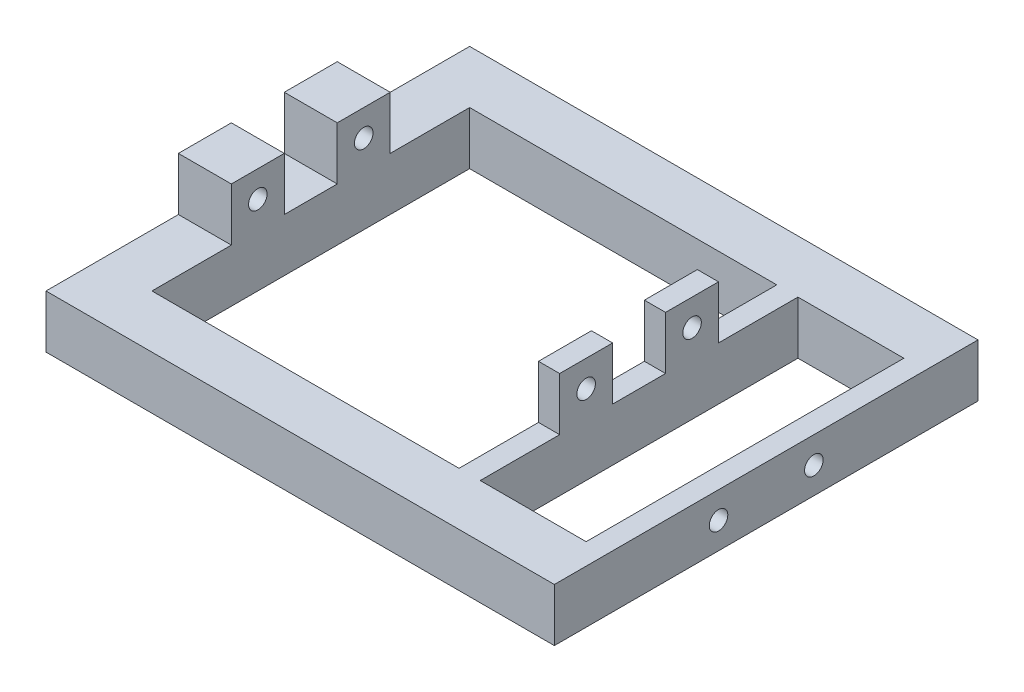
ISO-10303-21;
HEADER;
FILE_DESCRIPTION(('STEP AP214'),'2;1');
FILE_NAME('part.step','',(''),(''),'','','');
FILE_SCHEMA(('AUTOMOTIVE_DESIGN { 1 0 10303 214 1 1 1 1 }'));
ENDSEC;
DATA;
#1=APPLICATION_CONTEXT('core data for automotive mechanical design processes');
#2=APPLICATION_PROTOCOL_DEFINITION('international standard','automotive_design',2000,#1);
#3=PRODUCT_CONTEXT('',#1,'mechanical');
#4=PRODUCT('Part','Part','',(#3));
#5=PRODUCT_RELATED_PRODUCT_CATEGORY('part','',(#4));
#6=PRODUCT_DEFINITION_FORMATION('','',#4);
#7=PRODUCT_DEFINITION_CONTEXT('part definition',#1,'design');
#8=PRODUCT_DEFINITION('design','',#6,#7);
#9=PRODUCT_DEFINITION_SHAPE('','',#8);
#10=(LENGTH_UNIT() NAMED_UNIT(*) SI_UNIT(.MILLI.,.METRE.));
#11=(NAMED_UNIT(*) PLANE_ANGLE_UNIT() SI_UNIT($,.RADIAN.));
#12=(NAMED_UNIT(*) SI_UNIT($,.STERADIAN.) SOLID_ANGLE_UNIT());
#13=UNCERTAINTY_MEASURE_WITH_UNIT(LENGTH_MEASURE(1.E-05),#10,'distance_accuracy_value','');
#14=(GEOMETRIC_REPRESENTATION_CONTEXT(3) GLOBAL_UNCERTAINTY_ASSIGNED_CONTEXT((#13)) GLOBAL_UNIT_ASSIGNED_CONTEXT((#10,
#11,#12)) REPRESENTATION_CONTEXT('',''));
#15=CARTESIAN_POINT('',(0.,0.,0.));
#16=DIRECTION('',(0.,0.,1.));
#17=DIRECTION('',(1.,0.,0.));
#18=AXIS2_PLACEMENT_3D('',#15,#16,#17);
#19=CARTESIAN_POINT('',(0.,10.,0.));
#20=DIRECTION('',(0.,-1.,0.));
#21=DIRECTION('',(0.,0.,-1.));
#22=AXIS2_PLACEMENT_3D('',#19,#20,#21);
#23=PLANE('',#22);
#24=DIRECTION('',(1.,0.,0.));
#25=VECTOR('',#24,1.);
#26=CARTESIAN_POINT('',(0.,10.,-25.));
#27=LINE('',#26,#25);
#28=CARTESIAN_POINT('',(68.,10.,-25.));
#29=VERTEX_POINT('',#28);
#30=CARTESIAN_POINT('',(72.,10.,-25.));
#31=VERTEX_POINT('',#30);
#32=EDGE_CURVE('E442',#29,#31,#27,.T.);
#33=ORIENTED_EDGE('',*,*,#32,.F.);
#34=DIRECTION('',(0.,0.,-1.));
#35=VECTOR('',#34,1.);
#36=CARTESIAN_POINT('',(68.,10.,0.002000000000002));
#37=LINE('',#36,#35);
#38=CARTESIAN_POINT('',(68.,10.,-10.));
#39=VERTEX_POINT('',#38);
#40=EDGE_CURVE('E246',#39,#29,#37,.T.);
#41=ORIENTED_EDGE('',*,*,#40,.F.);
#42=DIRECTION('',(1.,0.,0.));
#43=VECTOR('',#42,1.);
#44=CARTESIAN_POINT('',(10.,10.,-10.));
#45=LINE('',#44,#43);
#46=CARTESIAN_POINT('',(10.,10.,-10.));
#47=VERTEX_POINT('',#46);
#48=EDGE_CURVE('E352',#47,#39,#45,.T.);
#49=ORIENTED_EDGE('',*,*,#48,.F.);
#50=DIRECTION('',(0.,0.,1.));
#51=VECTOR('',#50,1.);
#52=CARTESIAN_POINT('',(10.,10.,-70.));
#53=LINE('',#52,#51);
#54=CARTESIAN_POINT('',(10.,10.,-25.));
#55=VERTEX_POINT('',#54);
#56=EDGE_CURVE('E351',#55,#47,#53,.T.);
#57=ORIENTED_EDGE('',*,*,#56,.F.);
#58=DIRECTION('',(1.,0.,0.));
#59=VECTOR('',#58,1.);
#60=CARTESIAN_POINT('',(0.,10.,-25.));
#61=LINE('',#60,#59);
#62=CARTESIAN_POINT('',(0.,10.,-25.));
#63=VERTEX_POINT('',#62);
#64=EDGE_CURVE('E275',#63,#55,#61,.T.);
#65=ORIENTED_EDGE('',*,*,#64,.F.);
#66=DIRECTION('',(0.,0.,1.));
#67=VECTOR('',#66,1.);
#68=CARTESIAN_POINT('',(0.,10.,0.));
#69=LINE('',#68,#67);
#70=CARTESIAN_POINT('',(0.,10.,0.));
#71=VERTEX_POINT('',#70);
#72=EDGE_CURVE('E395',#63,#71,#69,.T.);
#73=ORIENTED_EDGE('',*,*,#72,.T.);
#74=DIRECTION('',(1.,0.,0.));
#75=VECTOR('',#74,1.);
#76=CARTESIAN_POINT('',(0.,10.,0.));
#77=LINE('',#76,#75);
#78=CARTESIAN_POINT('',(96.,10.,0.));
#79=VERTEX_POINT('',#78);
#80=EDGE_CURVE('E387',#71,#79,#77,.T.);
#81=ORIENTED_EDGE('',*,*,#80,.T.);
#82=DIRECTION('',(0.,0.,-1.));
#83=VECTOR('',#82,1.);
#84=CARTESIAN_POINT('',(96.,10.,-80.));
#85=LINE('',#84,#83);
#86=CARTESIAN_POINT('',(96.,10.,-80.));
#87=VERTEX_POINT('',#86);
#88=EDGE_CURVE('E390',#79,#87,#85,.T.);
#89=ORIENTED_EDGE('',*,*,#88,.T.);
#90=DIRECTION('',(-1.,0.,0.));
#91=VECTOR('',#90,1.);
#92=CARTESIAN_POINT('',(0.,10.,-80.));
#93=LINE('',#92,#91);
#94=CARTESIAN_POINT('',(0.,10.,-80.));
#95=VERTEX_POINT('',#94);
#96=EDGE_CURVE('E393',#87,#95,#93,.T.);
#97=ORIENTED_EDGE('',*,*,#96,.T.);
#98=CARTESIAN_POINT('',(0.,10.,-55.));
#99=VERTEX_POINT('',#98);
#100=EDGE_CURVE('E396',#95,#99,#69,.T.);
#101=ORIENTED_EDGE('',*,*,#100,.T.);
#102=DIRECTION('',(1.,0.,0.));
#103=VECTOR('',#102,1.);
#104=CARTESIAN_POINT('',(0.,10.,-55.));
#105=LINE('',#104,#103);
#106=CARTESIAN_POINT('',(10.,10.,-55.));
#107=VERTEX_POINT('',#106);
#108=EDGE_CURVE('E298',#99,#107,#105,.T.);
#109=ORIENTED_EDGE('',*,*,#108,.T.);
#110=CARTESIAN_POINT('',(10.,10.,-70.));
#111=VERTEX_POINT('',#110);
#112=EDGE_CURVE('E346',#111,#107,#53,.T.);
#113=ORIENTED_EDGE('',*,*,#112,.F.);
#114=DIRECTION('',(-1.,0.,0.));
#115=VECTOR('',#114,1.);
#116=CARTESIAN_POINT('',(10.,10.,-70.));
#117=LINE('',#116,#115);
#118=CARTESIAN_POINT('',(68.,10.,-70.));
#119=VERTEX_POINT('',#118);
#120=EDGE_CURVE('E358',#119,#111,#117,.T.);
#121=ORIENTED_EDGE('',*,*,#120,.F.);
#122=CARTESIAN_POINT('',(68.,10.,-55.));
#123=VERTEX_POINT('',#122);
#124=EDGE_CURVE('E342',#123,#119,#37,.T.);
#125=ORIENTED_EDGE('',*,*,#124,.F.);
#126=DIRECTION('',(1.,0.,0.));
#127=VECTOR('',#126,1.);
#128=CARTESIAN_POINT('',(0.,10.,-55.));
#129=LINE('',#128,#127);
#130=CARTESIAN_POINT('',(72.,10.,-55.));
#131=VERTEX_POINT('',#130);
#132=EDGE_CURVE('E62',#123,#131,#129,.T.);
#133=ORIENTED_EDGE('',*,*,#132,.T.);
#134=DIRECTION('',(0.,0.,-1.));
#135=VECTOR('',#134,1.);
#136=CARTESIAN_POINT('',(72.,10.,0.002000000000002));
#137=LINE('',#136,#135);
#138=CARTESIAN_POINT('',(72.,10.,-70.));
#139=VERTEX_POINT('',#138);
#140=EDGE_CURVE('E338',#131,#139,#137,.T.);
#141=ORIENTED_EDGE('',*,*,#140,.T.);
#142=CARTESIAN_POINT('',(92.,10.,-70.));
#143=VERTEX_POINT('',#142);
#144=EDGE_CURVE('E359',#143,#139,#117,.T.);
#145=ORIENTED_EDGE('',*,*,#144,.F.);
#146=DIRECTION('',(0.,0.,-1.));
#147=VECTOR('',#146,1.);
#148=CARTESIAN_POINT('',(92.,10.,-70.));
#149=LINE('',#148,#147);
#150=CARTESIAN_POINT('',(92.,10.,-10.));
#151=VERTEX_POINT('',#150);
#152=EDGE_CURVE('E355',#151,#143,#149,.T.);
#153=ORIENTED_EDGE('',*,*,#152,.F.);
#154=CARTESIAN_POINT('',(72.,10.,-10.));
#155=VERTEX_POINT('',#154);
#156=EDGE_CURVE('E349',#155,#151,#45,.T.);
#157=ORIENTED_EDGE('',*,*,#156,.F.);
#158=EDGE_CURVE('E339',#155,#31,#137,.T.);
#159=ORIENTED_EDGE('',*,*,#158,.T.);
#160=EDGE_LOOP('',(#33,#41,#49,#57,#65,#73,#81,#89,#97,#101,#109,#113,#121,#125,#133,#141,#145,
#153,#157,#159));
#161=FACE_BOUND('',#160,.T.);
#162=ADVANCED_FACE('F37',(#161),#23,.F.);
#163=CARTESIAN_POINT('',(68.,10.,-35.));
#164=VERTEX_POINT('',#163);
#165=CARTESIAN_POINT('',(68.,10.,-45.));
#166=VERTEX_POINT('',#165);
#167=EDGE_CURVE('E345',#164,#166,#37,.T.);
#168=ORIENTED_EDGE('',*,*,#167,.F.);
#169=DIRECTION('',(1.,0.,0.));
#170=VECTOR('',#169,1.);
#171=CARTESIAN_POINT('',(0.,10.,-35.));
#172=LINE('',#171,#170);
#173=CARTESIAN_POINT('',(72.,10.,-35.));
#174=VERTEX_POINT('',#173);
#175=EDGE_CURVE('E54',#164,#174,#172,.T.);
#176=ORIENTED_EDGE('',*,*,#175,.T.);
#177=CARTESIAN_POINT('',(72.,10.,-45.));
#178=VERTEX_POINT('',#177);
#179=EDGE_CURVE('E343',#174,#178,#137,.T.);
#180=ORIENTED_EDGE('',*,*,#179,.T.);
#181=DIRECTION('',(1.,0.,0.));
#182=VECTOR('',#181,1.);
#183=CARTESIAN_POINT('',(0.,10.,-45.));
#184=LINE('',#183,#182);
#185=EDGE_CURVE('E248',#166,#178,#184,.T.);
#186=ORIENTED_EDGE('',*,*,#185,.F.);
#187=EDGE_LOOP('',(#168,#176,#180,#186));
#188=FACE_BOUND('',#187,.T.);
#189=ADVANCED_FACE('F455',(#188),#23,.F.);
#190=DIRECTION('',(-1.,0.,0.));
#191=VECTOR('',#190,1.);
#192=CARTESIAN_POINT('',(0.,10.,-35.));
#193=LINE('',#192,#191);
#194=CARTESIAN_POINT('',(10.,10.,-35.));
#195=VERTEX_POINT('',#194);
#196=CARTESIAN_POINT('',(0.,10.,-35.));
#197=VERTEX_POINT('',#196);
#198=EDGE_CURVE('E280',#195,#197,#193,.T.);
#199=ORIENTED_EDGE('',*,*,#198,.F.);
#200=CARTESIAN_POINT('',(10.,10.,-45.));
#201=VERTEX_POINT('',#200);
#202=EDGE_CURVE('E350',#201,#195,#53,.T.);
#203=ORIENTED_EDGE('',*,*,#202,.F.);
#204=DIRECTION('',(-1.,0.,0.));
#205=VECTOR('',#204,1.);
#206=CARTESIAN_POINT('',(0.,10.,-45.));
#207=LINE('',#206,#205);
#208=CARTESIAN_POINT('',(0.,10.,-45.));
#209=VERTEX_POINT('',#208);
#210=EDGE_CURVE('E303',#201,#209,#207,.T.);
#211=ORIENTED_EDGE('',*,*,#210,.T.);
#212=EDGE_CURVE('E400',#209,#197,#69,.T.);
#213=ORIENTED_EDGE('',*,*,#212,.T.);
#214=EDGE_LOOP('',(#199,#203,#211,#213));
#215=FACE_BOUND('',#214,.T.);
#216=ADVANCED_FACE('F497',(#215),#23,.F.);
#217=CARTESIAN_POINT('',(10.,10.,-10.));
#218=DIRECTION('',(0.,0.,-1.));
#219=DIRECTION('',(-1.,0.,0.));
#220=AXIS2_PLACEMENT_3D('',#217,#218,#219);
#221=PLANE('',#220);
#222=DIRECTION('',(1.,0.,0.));
#223=VECTOR('',#222,1.);
#224=CARTESIAN_POINT('',(10.,0.,-10.));
#225=LINE('',#224,#223);
#226=CARTESIAN_POINT('',(72.,0.,-10.));
#227=VERTEX_POINT('',#226);
#228=CARTESIAN_POINT('',(92.,0.,-10.));
#229=VERTEX_POINT('',#228);
#230=EDGE_CURVE('E365',#227,#229,#225,.T.);
#231=ORIENTED_EDGE('',*,*,#230,.F.);
#232=DIRECTION('',(0.,-1.,0.));
#233=VECTOR('',#232,1.);
#234=CARTESIAN_POINT('',(72.,10.,-10.));
#235=LINE('',#234,#233);
#236=EDGE_CURVE('E324',#155,#227,#235,.T.);
#237=ORIENTED_EDGE('',*,*,#236,.F.);
#238=ORIENTED_EDGE('',*,*,#156,.T.);
#239=DIRECTION('',(0.,-1.,0.));
#240=VECTOR('',#239,1.);
#241=CARTESIAN_POINT('',(92.,10.,-10.));
#242=LINE('',#241,#240);
#243=EDGE_CURVE('E380',#151,#229,#242,.T.);
#244=ORIENTED_EDGE('',*,*,#243,.T.);
#245=EDGE_LOOP('',(#231,#237,#238,#244));
#246=FACE_BOUND('',#245,.T.);
#247=ADVANCED_FACE('F478',(#246),#221,.T.);
#248=ORIENTED_EDGE('',*,*,#48,.T.);
#249=DIRECTION('',(0.,1.,0.));
#250=VECTOR('',#249,1.);
#251=CARTESIAN_POINT('',(68.,10.,-10.));
#252=LINE('',#251,#250);
#253=CARTESIAN_POINT('',(68.,0.,-10.));
#254=VERTEX_POINT('',#253);
#255=EDGE_CURVE('E322',#254,#39,#252,.T.);
#256=ORIENTED_EDGE('',*,*,#255,.F.);
#257=CARTESIAN_POINT('',(10.,0.,-10.));
#258=VERTEX_POINT('',#257);
#259=EDGE_CURVE('E366',#258,#254,#225,.T.);
#260=ORIENTED_EDGE('',*,*,#259,.F.);
#261=DIRECTION('',(0.,-1.,0.));
#262=VECTOR('',#261,1.);
#263=CARTESIAN_POINT('',(10.,10.,-10.));
#264=LINE('',#263,#262);
#265=EDGE_CURVE('E383',#47,#258,#264,.T.);
#266=ORIENTED_EDGE('',*,*,#265,.F.);
#267=EDGE_LOOP('',(#248,#256,#260,#266));
#268=FACE_BOUND('',#267,.T.);
#269=ADVANCED_FACE('F507',(#268),#221,.T.);
#270=CARTESIAN_POINT('',(10.,10.,-70.));
#271=DIRECTION('',(0.,0.,1.));
#272=DIRECTION('',(1.,0.,0.));
#273=AXIS2_PLACEMENT_3D('',#270,#271,#272);
#274=PLANE('',#273);
#275=ORIENTED_EDGE('',*,*,#144,.T.);
#276=DIRECTION('',(0.,1.,0.));
#277=VECTOR('',#276,1.);
#278=CARTESIAN_POINT('',(72.,10.,-70.));
#279=LINE('',#278,#277);
#280=CARTESIAN_POINT('',(72.,0.,-70.));
#281=VERTEX_POINT('',#280);
#282=EDGE_CURVE('E328',#281,#139,#279,.T.);
#283=ORIENTED_EDGE('',*,*,#282,.F.);
#284=DIRECTION('',(-1.,0.,0.));
#285=VECTOR('',#284,1.);
#286=CARTESIAN_POINT('',(10.,0.,-70.));
#287=LINE('',#286,#285);
#288=CARTESIAN_POINT('',(92.,0.,-70.));
#289=VERTEX_POINT('',#288);
#290=EDGE_CURVE('E373',#289,#281,#287,.T.);
#291=ORIENTED_EDGE('',*,*,#290,.F.);
#292=DIRECTION('',(0.,-1.,0.));
#293=VECTOR('',#292,1.);
#294=CARTESIAN_POINT('',(92.,10.,-70.));
#295=LINE('',#294,#293);
#296=EDGE_CURVE('E378',#143,#289,#295,.T.);
#297=ORIENTED_EDGE('',*,*,#296,.F.);
#298=EDGE_LOOP('',(#275,#283,#291,#297));
#299=FACE_BOUND('',#298,.T.);
#300=ADVANCED_FACE('F469',(#299),#274,.T.);
#301=CARTESIAN_POINT('',(68.,0.,-70.));
#302=VERTEX_POINT('',#301);
#303=CARTESIAN_POINT('',(10.,0.,-70.));
#304=VERTEX_POINT('',#303);
#305=EDGE_CURVE('E372',#302,#304,#287,.T.);
#306=ORIENTED_EDGE('',*,*,#305,.F.);
#307=DIRECTION('',(0.,-1.,0.));
#308=VECTOR('',#307,1.);
#309=CARTESIAN_POINT('',(68.,10.,-70.));
#310=LINE('',#309,#308);
#311=EDGE_CURVE('E331',#119,#302,#310,.T.);
#312=ORIENTED_EDGE('',*,*,#311,.F.);
#313=ORIENTED_EDGE('',*,*,#120,.T.);
#314=DIRECTION('',(0.,-1.,0.));
#315=VECTOR('',#314,1.);
#316=CARTESIAN_POINT('',(10.,10.,-70.));
#317=LINE('',#316,#315);
#318=EDGE_CURVE('E362',#111,#304,#317,.T.);
#319=ORIENTED_EDGE('',*,*,#318,.T.);
#320=EDGE_LOOP('',(#306,#312,#313,#319));
#321=FACE_BOUND('',#320,.T.);
#322=ADVANCED_FACE('F482',(#321),#274,.T.);
#323=CARTESIAN_POINT('',(0.,0.,0.));
#324=DIRECTION('',(0.,-1.,0.));
#325=DIRECTION('',(0.,0.,-1.));
#326=AXIS2_PLACEMENT_3D('',#323,#324,#325);
#327=PLANE('',#326);
#328=ORIENTED_EDGE('',*,*,#259,.T.);
#329=DIRECTION('',(0.,0.,-1.));
#330=VECTOR('',#329,1.);
#331=CARTESIAN_POINT('',(68.,0.,0.002000000000002));
#332=LINE('',#331,#330);
#333=EDGE_CURVE('E327',#254,#302,#332,.T.);
#334=ORIENTED_EDGE('',*,*,#333,.T.);
#335=ORIENTED_EDGE('',*,*,#305,.T.);
#336=DIRECTION('',(0.,0.,1.));
#337=VECTOR('',#336,1.);
#338=CARTESIAN_POINT('',(10.,0.,-70.));
#339=LINE('',#338,#337);
#340=EDGE_CURVE('E333',#304,#258,#339,.T.);
#341=ORIENTED_EDGE('',*,*,#340,.T.);
#342=EDGE_LOOP('',(#328,#334,#335,#341));
#343=FACE_BOUND('',#342,.T.);
#344=DIRECTION('',(1.,0.,0.));
#345=VECTOR('',#344,1.);
#346=CARTESIAN_POINT('',(0.,0.,0.));
#347=LINE('',#346,#345);
#348=CARTESIAN_POINT('',(0.,0.,0.));
#349=VERTEX_POINT('',#348);
#350=CARTESIAN_POINT('',(96.,0.,0.));
#351=VERTEX_POINT('',#350);
#352=EDGE_CURVE('E386',#349,#351,#347,.T.);
#353=ORIENTED_EDGE('',*,*,#352,.F.);
#354=DIRECTION('',(0.,0.,1.));
#355=VECTOR('',#354,1.);
#356=CARTESIAN_POINT('',(0.,0.,0.));
#357=LINE('',#356,#355);
#358=CARTESIAN_POINT('',(0.,0.,-80.));
#359=VERTEX_POINT('',#358);
#360=EDGE_CURVE('E391',#359,#349,#357,.T.);
#361=ORIENTED_EDGE('',*,*,#360,.F.);
#362=DIRECTION('',(-1.,0.,0.));
#363=VECTOR('',#362,1.);
#364=CARTESIAN_POINT('',(0.,0.,-80.));
#365=LINE('',#364,#363);
#366=CARTESIAN_POINT('',(96.,0.,-80.));
#367=VERTEX_POINT('',#366);
#368=EDGE_CURVE('E405',#367,#359,#365,.T.);
#369=ORIENTED_EDGE('',*,*,#368,.F.);
#370=DIRECTION('',(0.,0.,-1.));
#371=VECTOR('',#370,1.);
#372=CARTESIAN_POINT('',(96.,0.,-80.));
#373=LINE('',#372,#371);
#374=EDGE_CURVE('E403',#351,#367,#373,.T.);
#375=ORIENTED_EDGE('',*,*,#374,.F.);
#376=EDGE_LOOP('',(#353,#361,#369,#375));
#377=FACE_BOUND('',#376,.T.);
#378=ORIENTED_EDGE('',*,*,#290,.T.);
#379=DIRECTION('',(0.,0.,-1.));
#380=VECTOR('',#379,1.);
#381=CARTESIAN_POINT('',(72.,0.,0.002000000000002));
#382=LINE('',#381,#380);
#383=EDGE_CURVE('E336',#227,#281,#382,.T.);
#384=ORIENTED_EDGE('',*,*,#383,.F.);
#385=ORIENTED_EDGE('',*,*,#230,.T.);
#386=DIRECTION('',(0.,0.,-1.));
#387=VECTOR('',#386,1.);
#388=CARTESIAN_POINT('',(92.,0.,-70.));
#389=LINE('',#388,#387);
#390=EDGE_CURVE('E369',#229,#289,#389,.T.);
#391=ORIENTED_EDGE('',*,*,#390,.T.);
#392=EDGE_LOOP('',(#378,#384,#385,#391));
#393=FACE_BOUND('',#392,.T.);
#394=ADVANCED_FACE('F480',(#343,#377,#393),#327,.T.);
#395=CARTESIAN_POINT('',(0.,10.,0.));
#396=DIRECTION('',(0.,0.,-1.));
#397=DIRECTION('',(-1.,0.,0.));
#398=AXIS2_PLACEMENT_3D('',#395,#396,#397);
#399=PLANE('',#398);
#400=ORIENTED_EDGE('',*,*,#352,.T.);
#401=DIRECTION('',(0.,-1.,0.));
#402=VECTOR('',#401,1.);
#403=CARTESIAN_POINT('',(96.,10.,0.));
#404=LINE('',#403,#402);
#405=EDGE_CURVE('E11',#79,#351,#404,.T.);
#406=ORIENTED_EDGE('',*,*,#405,.F.);
#407=ORIENTED_EDGE('',*,*,#80,.F.);
#408=DIRECTION('',(0.,-1.,0.));
#409=VECTOR('',#408,1.);
#410=CARTESIAN_POINT('',(0.,10.,0.));
#411=LINE('',#410,#409);
#412=EDGE_CURVE('E399',#71,#349,#411,.T.);
#413=ORIENTED_EDGE('',*,*,#412,.T.);
#414=EDGE_LOOP('',(#400,#406,#407,#413));
#415=FACE_BOUND('',#414,.T.);
#416=ADVANCED_FACE('F39',(#415),#399,.F.);
#417=CARTESIAN_POINT('',(96.,10.,-80.));
#418=DIRECTION('',(-1.,0.,0.));
#419=DIRECTION('',(0.,0.,1.));
#420=AXIS2_PLACEMENT_3D('',#417,#418,#419);
#421=PLANE('',#420);
#422=CARTESIAN_POINT('',(96.,5.,-31.));
#423=DIRECTION('',(1.,0.,0.));
#424=DIRECTION('',(0.,0.,-1.));
#425=AXIS2_PLACEMENT_3D('',#422,#423,#424);
#426=CIRCLE('',#425,1.75);
#427=CARTESIAN_POINT('',(96.,5.,-32.75));
#428=VERTEX_POINT('',#427);
#429=EDGE_CURVE('E438',#428,#428,#426,.T.);
#430=ORIENTED_EDGE('',*,*,#429,.F.);
#431=EDGE_LOOP('',(#430));
#432=FACE_BOUND('',#431,.T.);
#433=CARTESIAN_POINT('',(96.,5.,-49.));
#434=DIRECTION('',(1.,0.,0.));
#435=DIRECTION('',(0.,0.,-1.));
#436=AXIS2_PLACEMENT_3D('',#433,#434,#435);
#437=CIRCLE('',#436,1.75);
#438=CARTESIAN_POINT('',(96.,5.,-50.75));
#439=VERTEX_POINT('',#438);
#440=EDGE_CURVE('E580',#439,#439,#437,.T.);
#441=ORIENTED_EDGE('',*,*,#440,.F.);
#442=EDGE_LOOP('',(#441));
#443=FACE_BOUND('',#442,.T.);
#444=ORIENTED_EDGE('',*,*,#374,.T.);
#445=DIRECTION('',(0.,-1.,0.));
#446=VECTOR('',#445,1.);
#447=CARTESIAN_POINT('',(96.,10.,-80.));
#448=LINE('',#447,#446);
#449=EDGE_CURVE('E46',#87,#367,#448,.T.);
#450=ORIENTED_EDGE('',*,*,#449,.F.);
#451=ORIENTED_EDGE('',*,*,#88,.F.);
#452=ORIENTED_EDGE('',*,*,#405,.T.);
#453=EDGE_LOOP('',(#444,#450,#451,#452));
#454=FACE_BOUND('',#453,.T.);
#455=ADVANCED_FACE('F489',(#432,#443,#454),#421,.F.);
#456=CARTESIAN_POINT('',(0.,10.,-80.));
#457=DIRECTION('',(0.,0.,1.));
#458=DIRECTION('',(1.,0.,0.));
#459=AXIS2_PLACEMENT_3D('',#456,#457,#458);
#460=PLANE('',#459);
#461=ORIENTED_EDGE('',*,*,#368,.T.);
#462=DIRECTION('',(0.,-1.,0.));
#463=VECTOR('',#462,1.);
#464=CARTESIAN_POINT('',(0.,10.,-80.));
#465=LINE('',#464,#463);
#466=EDGE_CURVE('E410',#95,#359,#465,.T.);
#467=ORIENTED_EDGE('',*,*,#466,.F.);
#468=ORIENTED_EDGE('',*,*,#96,.F.);
#469=ORIENTED_EDGE('',*,*,#449,.T.);
#470=EDGE_LOOP('',(#461,#467,#468,#469));
#471=FACE_BOUND('',#470,.T.);
#472=ADVANCED_FACE('F564',(#471),#460,.F.);
#473=CARTESIAN_POINT('',(0.,10.,0.));
#474=DIRECTION('',(1.,0.,0.));
#475=DIRECTION('',(0.,0.,-1.));
#476=AXIS2_PLACEMENT_3D('',#473,#474,#475);
#477=PLANE('',#476);
#478=CARTESIAN_POINT('',(0.,15.,-30.));
#479=DIRECTION('',(1.,0.,0.));
#480=DIRECTION('',(0.,0.,-1.));
#481=AXIS2_PLACEMENT_3D('',#478,#479,#480);
#482=CIRCLE('',#481,1.75);
#483=CARTESIAN_POINT('',(0.,15.,-31.75));
#484=VERTEX_POINT('',#483);
#485=EDGE_CURVE('E417',#484,#484,#482,.T.);
#486=ORIENTED_EDGE('',*,*,#485,.T.);
#487=EDGE_LOOP('',(#486));
#488=FACE_BOUND('',#487,.T.);
#489=CARTESIAN_POINT('',(0.,15.,-50.));
#490=DIRECTION('',(1.,0.,0.));
#491=DIRECTION('',(0.,0.,-1.));
#492=AXIS2_PLACEMENT_3D('',#489,#490,#491);
#493=CIRCLE('',#492,1.75);
#494=CARTESIAN_POINT('',(0.,15.,-51.75));
#495=VERTEX_POINT('',#494);
#496=EDGE_CURVE('E428',#495,#495,#493,.T.);
#497=ORIENTED_EDGE('',*,*,#496,.T.);
#498=EDGE_LOOP('',(#497));
#499=FACE_BOUND('',#498,.T.);
#500=ORIENTED_EDGE('',*,*,#360,.T.);
#501=ORIENTED_EDGE('',*,*,#412,.F.);
#502=ORIENTED_EDGE('',*,*,#72,.F.);
#503=DIRECTION('',(0.,-1.,0.));
#504=VECTOR('',#503,1.);
#505=CARTESIAN_POINT('',(0.,20.,-25.));
#506=LINE('',#505,#504);
#507=CARTESIAN_POINT('',(0.,20.,-25.));
#508=VERTEX_POINT('',#507);
#509=EDGE_CURVE('E296',#508,#63,#506,.T.);
#510=ORIENTED_EDGE('',*,*,#509,.F.);
#511=DIRECTION('',(0.,0.,1.));
#512=VECTOR('',#511,1.);
#513=CARTESIAN_POINT('',(0.,20.,0.));
#514=LINE('',#513,#512);
#515=CARTESIAN_POINT('',(0.,20.,-35.));
#516=VERTEX_POINT('',#515);
#517=EDGE_CURVE('E276',#516,#508,#514,.T.);
#518=ORIENTED_EDGE('',*,*,#517,.F.);
#519=DIRECTION('',(0.,-1.,0.));
#520=VECTOR('',#519,1.);
#521=CARTESIAN_POINT('',(0.,20.,-35.));
#522=LINE('',#521,#520);
#523=EDGE_CURVE('E286',#516,#197,#522,.T.);
#524=ORIENTED_EDGE('',*,*,#523,.T.);
#525=ORIENTED_EDGE('',*,*,#212,.F.);
#526=DIRECTION('',(0.,-1.,0.));
#527=VECTOR('',#526,1.);
#528=CARTESIAN_POINT('',(0.,20.,-45.));
#529=LINE('',#528,#527);
#530=CARTESIAN_POINT('',(0.,20.,-45.));
#531=VERTEX_POINT('',#530);
#532=EDGE_CURVE('E318',#531,#209,#529,.T.);
#533=ORIENTED_EDGE('',*,*,#532,.F.);
#534=DIRECTION('',(0.,0.,1.));
#535=VECTOR('',#534,1.);
#536=CARTESIAN_POINT('',(0.,20.,0.));
#537=LINE('',#536,#535);
#538=CARTESIAN_POINT('',(0.,20.,-55.));
#539=VERTEX_POINT('',#538);
#540=EDGE_CURVE('E302',#539,#531,#537,.T.);
#541=ORIENTED_EDGE('',*,*,#540,.F.);
#542=DIRECTION('',(0.,-1.,0.));
#543=VECTOR('',#542,1.);
#544=CARTESIAN_POINT('',(0.,20.,-55.));
#545=LINE('',#544,#543);
#546=EDGE_CURVE('E320',#539,#99,#545,.T.);
#547=ORIENTED_EDGE('',*,*,#546,.T.);
#548=ORIENTED_EDGE('',*,*,#100,.F.);
#549=ORIENTED_EDGE('',*,*,#466,.T.);
#550=EDGE_LOOP('',(#500,#501,#502,#510,#518,#524,#525,#533,#541,#547,#548,#549));
#551=FACE_BOUND('',#550,.T.);
#552=ADVANCED_FACE('F549',(#488,#499,#551),#477,.F.);
#553=CARTESIAN_POINT('',(10.,10.,-70.));
#554=DIRECTION('',(1.,0.,0.));
#555=DIRECTION('',(0.,0.,-1.));
#556=AXIS2_PLACEMENT_3D('',#553,#554,#555);
#557=PLANE('',#556);
#558=CARTESIAN_POINT('',(10.,15.,-30.));
#559=DIRECTION('',(1.,0.,0.));
#560=DIRECTION('',(0.,0.,-1.));
#561=AXIS2_PLACEMENT_3D('',#558,#559,#560);
#562=CIRCLE('',#561,1.75);
#563=CARTESIAN_POINT('',(10.,15.,-31.75));
#564=VERTEX_POINT('',#563);
#565=EDGE_CURVE('E440',#564,#564,#562,.T.);
#566=ORIENTED_EDGE('',*,*,#565,.F.);
#567=EDGE_LOOP('',(#566));
#568=FACE_BOUND('',#567,.T.);
#569=CARTESIAN_POINT('',(10.,15.,-50.));
#570=DIRECTION('',(1.,0.,0.));
#571=DIRECTION('',(0.,0.,-1.));
#572=AXIS2_PLACEMENT_3D('',#569,#570,#571);
#573=CIRCLE('',#572,1.75);
#574=CARTESIAN_POINT('',(10.,15.,-51.75));
#575=VERTEX_POINT('',#574);
#576=EDGE_CURVE('E416',#575,#575,#573,.T.);
#577=ORIENTED_EDGE('',*,*,#576,.F.);
#578=EDGE_LOOP('',(#577));
#579=FACE_BOUND('',#578,.T.);
#580=ORIENTED_EDGE('',*,*,#340,.F.);
#581=ORIENTED_EDGE('',*,*,#318,.F.);
#582=ORIENTED_EDGE('',*,*,#112,.T.);
#583=DIRECTION('',(0.,-1.,0.));
#584=VECTOR('',#583,1.);
#585=CARTESIAN_POINT('',(10.,20.,-55.));
#586=LINE('',#585,#584);
#587=CARTESIAN_POINT('',(10.,20.,-55.));
#588=VERTEX_POINT('',#587);
#589=EDGE_CURVE('E310',#588,#107,#586,.T.);
#590=ORIENTED_EDGE('',*,*,#589,.F.);
#591=DIRECTION('',(0.,0.,-1.));
#592=VECTOR('',#591,1.);
#593=CARTESIAN_POINT('',(10.,20.,0.));
#594=LINE('',#593,#592);
#595=CARTESIAN_POINT('',(10.,20.,-45.));
#596=VERTEX_POINT('',#595);
#597=EDGE_CURVE('E308',#596,#588,#594,.T.);
#598=ORIENTED_EDGE('',*,*,#597,.F.);
#599=DIRECTION('',(0.,-1.,0.));
#600=VECTOR('',#599,1.);
#601=CARTESIAN_POINT('',(10.,20.,-45.));
#602=LINE('',#601,#600);
#603=EDGE_CURVE('E316',#596,#201,#602,.T.);
#604=ORIENTED_EDGE('',*,*,#603,.T.);
#605=ORIENTED_EDGE('',*,*,#202,.T.);
#606=DIRECTION('',(0.,-1.,0.));
#607=VECTOR('',#606,1.);
#608=CARTESIAN_POINT('',(10.,20.,-35.));
#609=LINE('',#608,#607);
#610=CARTESIAN_POINT('',(10.,20.,-35.));
#611=VERTEX_POINT('',#610);
#612=EDGE_CURVE('E292',#611,#195,#609,.T.);
#613=ORIENTED_EDGE('',*,*,#612,.F.);
#614=DIRECTION('',(0.,0.,-1.));
#615=VECTOR('',#614,1.);
#616=CARTESIAN_POINT('',(10.,20.,0.));
#617=LINE('',#616,#615);
#618=CARTESIAN_POINT('',(10.,20.,-25.));
#619=VERTEX_POINT('',#618);
#620=EDGE_CURVE('E282',#619,#611,#617,.T.);
#621=ORIENTED_EDGE('',*,*,#620,.F.);
#622=DIRECTION('',(0.,-1.,0.));
#623=VECTOR('',#622,1.);
#624=CARTESIAN_POINT('',(10.,20.,-25.));
#625=LINE('',#624,#623);
#626=EDGE_CURVE('E294',#619,#55,#625,.T.);
#627=ORIENTED_EDGE('',*,*,#626,.T.);
#628=ORIENTED_EDGE('',*,*,#56,.T.);
#629=ORIENTED_EDGE('',*,*,#265,.T.);
#630=EDGE_LOOP('',(#580,#581,#582,#590,#598,#604,#605,#613,#621,#627,#628,#629));
#631=FACE_BOUND('',#630,.T.);
#632=ADVANCED_FACE('F519',(#568,#579,#631),#557,.T.);
#633=CARTESIAN_POINT('',(92.,10.,-70.));
#634=DIRECTION('',(-1.,0.,0.));
#635=DIRECTION('',(0.,0.,1.));
#636=AXIS2_PLACEMENT_3D('',#633,#634,#635);
#637=PLANE('',#636);
#638=CARTESIAN_POINT('',(92.,5.,-31.));
#639=DIRECTION('',(-1.,0.,0.));
#640=DIRECTION('',(0.,0.,1.));
#641=AXIS2_PLACEMENT_3D('',#638,#639,#640);
#642=CIRCLE('',#641,1.75);
#643=CARTESIAN_POINT('',(92.,5.,-29.25));
#644=VERTEX_POINT('',#643);
#645=EDGE_CURVE('E582',#644,#644,#642,.F.);
#646=ORIENTED_EDGE('',*,*,#645,.T.);
#647=EDGE_LOOP('',(#646));
#648=FACE_BOUND('',#647,.T.);
#649=CARTESIAN_POINT('',(92.,5.,-49.));
#650=DIRECTION('',(-1.,0.,0.));
#651=DIRECTION('',(0.,0.,1.));
#652=AXIS2_PLACEMENT_3D('',#649,#650,#651);
#653=CIRCLE('',#652,1.75);
#654=CARTESIAN_POINT('',(92.,5.,-47.25));
#655=VERTEX_POINT('',#654);
#656=EDGE_CURVE('E431',#655,#655,#653,.F.);
#657=ORIENTED_EDGE('',*,*,#656,.T.);
#658=EDGE_LOOP('',(#657));
#659=FACE_BOUND('',#658,.T.);
#660=ORIENTED_EDGE('',*,*,#390,.F.);
#661=ORIENTED_EDGE('',*,*,#243,.F.);
#662=ORIENTED_EDGE('',*,*,#152,.T.);
#663=ORIENTED_EDGE('',*,*,#296,.T.);
#664=EDGE_LOOP('',(#660,#661,#662,#663));
#665=FACE_BOUND('',#664,.T.);
#666=ADVANCED_FACE('F473',(#648,#659,#665),#637,.T.);
#667=CARTESIAN_POINT('',(72.,10.,0.002000000000002));
#668=DIRECTION('',(-1.,0.,0.));
#669=DIRECTION('',(0.,0.,1.));
#670=AXIS2_PLACEMENT_3D('',#667,#668,#669);
#671=PLANE('',#670);
#672=CARTESIAN_POINT('',(72.,15.,-30.));
#673=DIRECTION('',(1.,0.,0.));
#674=DIRECTION('',(0.,0.,-1.));
#675=AXIS2_PLACEMENT_3D('',#672,#673,#674);
#676=CIRCLE('',#675,1.75);
#677=CARTESIAN_POINT('',(72.,15.,-31.75));
#678=VERTEX_POINT('',#677);
#679=EDGE_CURVE('E423',#678,#678,#676,.T.);
#680=ORIENTED_EDGE('',*,*,#679,.F.);
#681=EDGE_LOOP('',(#680));
#682=FACE_BOUND('',#681,.T.);
#683=CARTESIAN_POINT('',(72.,15.,-50.));
#684=DIRECTION('',(1.,0.,0.));
#685=DIRECTION('',(0.,0.,-1.));
#686=AXIS2_PLACEMENT_3D('',#683,#684,#685);
#687=CIRCLE('',#686,1.75);
#688=CARTESIAN_POINT('',(72.,15.,-51.75));
#689=VERTEX_POINT('',#688);
#690=EDGE_CURVE('E436',#689,#689,#687,.T.);
#691=ORIENTED_EDGE('',*,*,#690,.F.);
#692=EDGE_LOOP('',(#691));
#693=FACE_BOUND('',#692,.T.);
#694=ORIENTED_EDGE('',*,*,#158,.F.);
#695=ORIENTED_EDGE('',*,*,#236,.T.);
#696=ORIENTED_EDGE('',*,*,#383,.T.);
#697=ORIENTED_EDGE('',*,*,#282,.T.);
#698=ORIENTED_EDGE('',*,*,#140,.F.);
#699=DIRECTION('',(0.,-1.,0.));
#700=VECTOR('',#699,1.);
#701=CARTESIAN_POINT('',(72.,20.,-55.));
#702=LINE('',#701,#700);
#703=CARTESIAN_POINT('',(72.,20.,-55.));
#704=VERTEX_POINT('',#703);
#705=EDGE_CURVE('E262',#704,#131,#702,.T.);
#706=ORIENTED_EDGE('',*,*,#705,.F.);
#707=DIRECTION('',(0.,0.,-1.));
#708=VECTOR('',#707,1.);
#709=CARTESIAN_POINT('',(72.,20.,0.));
#710=LINE('',#709,#708);
#711=CARTESIAN_POINT('',(72.,20.,-45.));
#712=VERTEX_POINT('',#711);
#713=EDGE_CURVE('E261',#712,#704,#710,.T.);
#714=ORIENTED_EDGE('',*,*,#713,.F.);
#715=DIRECTION('',(0.,-1.,0.));
#716=VECTOR('',#715,1.);
#717=CARTESIAN_POINT('',(72.,20.,-45.));
#718=LINE('',#717,#716);
#719=EDGE_CURVE('E267',#712,#178,#718,.T.);
#720=ORIENTED_EDGE('',*,*,#719,.T.);
#721=ORIENTED_EDGE('',*,*,#179,.F.);
#722=DIRECTION('',(0.,-1.,0.));
#723=VECTOR('',#722,1.);
#724=CARTESIAN_POINT('',(72.,20.,-35.));
#725=LINE('',#724,#723);
#726=CARTESIAN_POINT('',(72.,20.,-35.));
#727=VERTEX_POINT('',#726);
#728=EDGE_CURVE('E250',#727,#174,#725,.T.);
#729=ORIENTED_EDGE('',*,*,#728,.F.);
#730=DIRECTION('',(0.,0.,-1.));
#731=VECTOR('',#730,1.);
#732=CARTESIAN_POINT('',(72.,20.,0.));
#733=LINE('',#732,#731);
#734=CARTESIAN_POINT('',(72.,20.,-25.));
#735=VERTEX_POINT('',#734);
#736=EDGE_CURVE('E233',#735,#727,#733,.T.);
#737=ORIENTED_EDGE('',*,*,#736,.F.);
#738=DIRECTION('',(0.,-1.,0.));
#739=VECTOR('',#738,1.);
#740=CARTESIAN_POINT('',(72.,20.,-25.));
#741=LINE('',#740,#739);
#742=EDGE_CURVE('E230',#735,#31,#741,.T.);
#743=ORIENTED_EDGE('',*,*,#742,.T.);
#744=EDGE_LOOP('',(#694,#695,#696,#697,#698,#706,#714,#720,#721,#729,#737,#743));
#745=FACE_BOUND('',#744,.T.);
#746=ADVANCED_FACE('F457',(#682,#693,#745),#671,.F.);
#747=CARTESIAN_POINT('',(68.,10.,0.002000000000002));
#748=DIRECTION('',(1.,0.,0.));
#749=DIRECTION('',(0.,0.,-1.));
#750=AXIS2_PLACEMENT_3D('',#747,#748,#749);
#751=PLANE('',#750);
#752=CARTESIAN_POINT('',(68.,15.,-30.));
#753=DIRECTION('',(1.,0.,0.));
#754=DIRECTION('',(0.,0.,-1.));
#755=AXIS2_PLACEMENT_3D('',#752,#753,#754);
#756=CIRCLE('',#755,1.75);
#757=CARTESIAN_POINT('',(68.,15.,-31.75));
#758=VERTEX_POINT('',#757);
#759=EDGE_CURVE('E41',#758,#758,#756,.T.);
#760=ORIENTED_EDGE('',*,*,#759,.T.);
#761=EDGE_LOOP('',(#760));
#762=FACE_BOUND('',#761,.T.);
#763=CARTESIAN_POINT('',(68.,15.,-50.));
#764=DIRECTION('',(1.,0.,0.));
#765=DIRECTION('',(0.,0.,-1.));
#766=AXIS2_PLACEMENT_3D('',#763,#764,#765);
#767=CIRCLE('',#766,1.75);
#768=CARTESIAN_POINT('',(68.,15.,-51.75));
#769=VERTEX_POINT('',#768);
#770=EDGE_CURVE('E414',#769,#769,#767,.T.);
#771=ORIENTED_EDGE('',*,*,#770,.T.);
#772=EDGE_LOOP('',(#771));
#773=FACE_BOUND('',#772,.T.);
#774=ORIENTED_EDGE('',*,*,#333,.F.);
#775=ORIENTED_EDGE('',*,*,#255,.T.);
#776=ORIENTED_EDGE('',*,*,#40,.T.);
#777=DIRECTION('',(0.,-1.,0.));
#778=VECTOR('',#777,1.);
#779=CARTESIAN_POINT('',(68.,20.,-25.));
#780=LINE('',#779,#778);
#781=CARTESIAN_POINT('',(68.,20.,-25.));
#782=VERTEX_POINT('',#781);
#783=EDGE_CURVE('E227',#782,#29,#780,.T.);
#784=ORIENTED_EDGE('',*,*,#783,.F.);
#785=DIRECTION('',(0.,0.,1.));
#786=VECTOR('',#785,1.);
#787=CARTESIAN_POINT('',(68.,20.,0.));
#788=LINE('',#787,#786);
#789=CARTESIAN_POINT('',(68.,20.,-35.));
#790=VERTEX_POINT('',#789);
#791=EDGE_CURVE('E234',#790,#782,#788,.T.);
#792=ORIENTED_EDGE('',*,*,#791,.F.);
#793=DIRECTION('',(0.,-1.,0.));
#794=VECTOR('',#793,1.);
#795=CARTESIAN_POINT('',(68.,20.,-35.));
#796=LINE('',#795,#794);
#797=EDGE_CURVE('E446',#790,#164,#796,.T.);
#798=ORIENTED_EDGE('',*,*,#797,.T.);
#799=ORIENTED_EDGE('',*,*,#167,.T.);
#800=DIRECTION('',(0.,-1.,0.));
#801=VECTOR('',#800,1.);
#802=CARTESIAN_POINT('',(68.,20.,-45.));
#803=LINE('',#802,#801);
#804=CARTESIAN_POINT('',(68.,20.,-45.));
#805=VERTEX_POINT('',#804);
#806=EDGE_CURVE('E270',#805,#166,#803,.T.);
#807=ORIENTED_EDGE('',*,*,#806,.F.);
#808=DIRECTION('',(0.,0.,1.));
#809=VECTOR('',#808,1.);
#810=CARTESIAN_POINT('',(68.,20.,0.));
#811=LINE('',#810,#809);
#812=CARTESIAN_POINT('',(68.,20.,-55.));
#813=VERTEX_POINT('',#812);
#814=EDGE_CURVE('E257',#813,#805,#811,.T.);
#815=ORIENTED_EDGE('',*,*,#814,.F.);
#816=DIRECTION('',(0.,-1.,0.));
#817=VECTOR('',#816,1.);
#818=CARTESIAN_POINT('',(68.,20.,-55.));
#819=LINE('',#818,#817);
#820=EDGE_CURVE('E273',#813,#123,#819,.T.);
#821=ORIENTED_EDGE('',*,*,#820,.T.);
#822=ORIENTED_EDGE('',*,*,#124,.T.);
#823=ORIENTED_EDGE('',*,*,#311,.T.);
#824=EDGE_LOOP('',(#774,#775,#776,#784,#792,#798,#799,#807,#815,#821,#822,#823));
#825=FACE_BOUND('',#824,.T.);
#826=ADVANCED_FACE('F244',(#762,#773,#825),#751,.F.);
#827=CARTESIAN_POINT('',(0.,20.,-55.));
#828=DIRECTION('',(0.,0.,-1.));
#829=DIRECTION('',(-1.,0.,0.));
#830=AXIS2_PLACEMENT_3D('',#827,#828,#829);
#831=PLANE('',#830);
#832=ORIENTED_EDGE('',*,*,#108,.F.);
#833=ORIENTED_EDGE('',*,*,#546,.F.);
#834=DIRECTION('',(1.,0.,0.));
#835=VECTOR('',#834,1.);
#836=CARTESIAN_POINT('',(0.,20.,-55.));
#837=LINE('',#836,#835);
#838=EDGE_CURVE('E299',#539,#588,#837,.T.);
#839=ORIENTED_EDGE('',*,*,#838,.T.);
#840=ORIENTED_EDGE('',*,*,#589,.T.);
#841=EDGE_LOOP('',(#832,#833,#839,#840));
#842=FACE_BOUND('',#841,.T.);
#843=ADVANCED_FACE('F541',(#842),#831,.T.);
#844=CARTESIAN_POINT('',(0.,20.,-45.));
#845=DIRECTION('',(0.,0.,1.));
#846=DIRECTION('',(1.,0.,0.));
#847=AXIS2_PLACEMENT_3D('',#844,#845,#846);
#848=PLANE('',#847);
#849=ORIENTED_EDGE('',*,*,#210,.F.);
#850=ORIENTED_EDGE('',*,*,#603,.F.);
#851=DIRECTION('',(-1.,0.,0.));
#852=VECTOR('',#851,1.);
#853=CARTESIAN_POINT('',(0.,20.,-45.));
#854=LINE('',#853,#852);
#855=EDGE_CURVE('E305',#596,#531,#854,.T.);
#856=ORIENTED_EDGE('',*,*,#855,.T.);
#857=ORIENTED_EDGE('',*,*,#532,.T.);
#858=EDGE_LOOP('',(#849,#850,#856,#857));
#859=FACE_BOUND('',#858,.T.);
#860=ADVANCED_FACE('F547',(#859),#848,.T.);
#861=CARTESIAN_POINT('',(0.,20.,0.));
#862=DIRECTION('',(0.,1.,0.));
#863=DIRECTION('',(0.,0.,1.));
#864=AXIS2_PLACEMENT_3D('',#861,#862,#863);
#865=PLANE('',#864);
#866=ORIENTED_EDGE('',*,*,#838,.F.);
#867=ORIENTED_EDGE('',*,*,#540,.T.);
#868=ORIENTED_EDGE('',*,*,#855,.F.);
#869=ORIENTED_EDGE('',*,*,#597,.T.);
#870=EDGE_LOOP('',(#866,#867,#868,#869));
#871=FACE_BOUND('',#870,.T.);
#872=ADVANCED_FACE('F544',(#871),#865,.T.);
#873=CARTESIAN_POINT('',(0.,20.,-25.));
#874=DIRECTION('',(0.,0.,-1.));
#875=DIRECTION('',(-1.,0.,0.));
#876=AXIS2_PLACEMENT_3D('',#873,#874,#875);
#877=PLANE('',#876);
#878=ORIENTED_EDGE('',*,*,#64,.T.);
#879=ORIENTED_EDGE('',*,*,#626,.F.);
#880=DIRECTION('',(1.,0.,0.));
#881=VECTOR('',#880,1.);
#882=CARTESIAN_POINT('',(0.,20.,-25.));
#883=LINE('',#882,#881);
#884=EDGE_CURVE('E279',#508,#619,#883,.T.);
#885=ORIENTED_EDGE('',*,*,#884,.F.);
#886=ORIENTED_EDGE('',*,*,#509,.T.);
#887=EDGE_LOOP('',(#878,#879,#885,#886));
#888=FACE_BOUND('',#887,.T.);
#889=ADVANCED_FACE('F634',(#888),#877,.F.);
#890=CARTESIAN_POINT('',(0.,20.,-35.));
#891=DIRECTION('',(0.,0.,1.));
#892=DIRECTION('',(1.,0.,0.));
#893=AXIS2_PLACEMENT_3D('',#890,#891,#892);
#894=PLANE('',#893);
#895=ORIENTED_EDGE('',*,*,#198,.T.);
#896=ORIENTED_EDGE('',*,*,#523,.F.);
#897=DIRECTION('',(-1.,0.,0.));
#898=VECTOR('',#897,1.);
#899=CARTESIAN_POINT('',(0.,20.,-35.));
#900=LINE('',#899,#898);
#901=EDGE_CURVE('E284',#611,#516,#900,.T.);
#902=ORIENTED_EDGE('',*,*,#901,.F.);
#903=ORIENTED_EDGE('',*,*,#612,.T.);
#904=EDGE_LOOP('',(#895,#896,#902,#903));
#905=FACE_BOUND('',#904,.T.);
#906=ADVANCED_FACE('F630',(#905),#894,.F.);
#907=CARTESIAN_POINT('',(0.,20.,0.));
#908=DIRECTION('',(0.,1.,0.));
#909=DIRECTION('',(0.,0.,1.));
#910=AXIS2_PLACEMENT_3D('',#907,#908,#909);
#911=PLANE('',#910);
#912=ORIENTED_EDGE('',*,*,#517,.T.);
#913=ORIENTED_EDGE('',*,*,#884,.T.);
#914=ORIENTED_EDGE('',*,*,#620,.T.);
#915=ORIENTED_EDGE('',*,*,#901,.T.);
#916=EDGE_LOOP('',(#912,#913,#914,#915));
#917=FACE_BOUND('',#916,.T.);
#918=ADVANCED_FACE('F627',(#917),#911,.T.);
#919=CARTESIAN_POINT('',(0.,20.,-55.));
#920=DIRECTION('',(0.,0.,-1.));
#921=DIRECTION('',(-1.,0.,0.));
#922=AXIS2_PLACEMENT_3D('',#919,#920,#921);
#923=PLANE('',#922);
#924=ORIENTED_EDGE('',*,*,#132,.F.);
#925=ORIENTED_EDGE('',*,*,#820,.F.);
#926=DIRECTION('',(1.,0.,0.));
#927=VECTOR('',#926,1.);
#928=CARTESIAN_POINT('',(0.,20.,-55.));
#929=LINE('',#928,#927);
#930=EDGE_CURVE('E254',#813,#704,#929,.T.);
#931=ORIENTED_EDGE('',*,*,#930,.T.);
#932=ORIENTED_EDGE('',*,*,#705,.T.);
#933=EDGE_LOOP('',(#924,#925,#931,#932));
#934=FACE_BOUND('',#933,.T.);
#935=ADVANCED_FACE('F623',(#934),#923,.T.);
#936=CARTESIAN_POINT('',(0.,20.,-45.));
#937=DIRECTION('',(0.,0.,-1.));
#938=DIRECTION('',(-1.,0.,0.));
#939=AXIS2_PLACEMENT_3D('',#936,#937,#938);
#940=PLANE('',#939);
#941=ORIENTED_EDGE('',*,*,#185,.T.);
#942=ORIENTED_EDGE('',*,*,#719,.F.);
#943=DIRECTION('',(1.,0.,0.));
#944=VECTOR('',#943,1.);
#945=CARTESIAN_POINT('',(0.,20.,-45.));
#946=LINE('',#945,#944);
#947=EDGE_CURVE('E259',#805,#712,#946,.T.);
#948=ORIENTED_EDGE('',*,*,#947,.F.);
#949=ORIENTED_EDGE('',*,*,#806,.T.);
#950=EDGE_LOOP('',(#941,#942,#948,#949));
#951=FACE_BOUND('',#950,.T.);
#952=ADVANCED_FACE('F619',(#951),#940,.F.);
#953=CARTESIAN_POINT('',(0.,20.,0.));
#954=DIRECTION('',(0.,1.,0.));
#955=DIRECTION('',(0.,0.,1.));
#956=AXIS2_PLACEMENT_3D('',#953,#954,#955);
#957=PLANE('',#956);
#958=ORIENTED_EDGE('',*,*,#930,.F.);
#959=ORIENTED_EDGE('',*,*,#814,.T.);
#960=ORIENTED_EDGE('',*,*,#947,.T.);
#961=ORIENTED_EDGE('',*,*,#713,.T.);
#962=EDGE_LOOP('',(#958,#959,#960,#961));
#963=FACE_BOUND('',#962,.T.);
#964=ADVANCED_FACE('F616',(#963),#957,.T.);
#965=CARTESIAN_POINT('',(0.,20.,-25.));
#966=DIRECTION('',(0.,0.,-1.));
#967=DIRECTION('',(-1.,0.,0.));
#968=AXIS2_PLACEMENT_3D('',#965,#966,#967);
#969=PLANE('',#968);
#970=ORIENTED_EDGE('',*,*,#32,.T.);
#971=ORIENTED_EDGE('',*,*,#742,.F.);
#972=DIRECTION('',(1.,0.,0.));
#973=VECTOR('',#972,1.);
#974=CARTESIAN_POINT('',(0.,20.,-25.));
#975=LINE('',#974,#973);
#976=EDGE_CURVE('E223',#782,#735,#975,.T.);
#977=ORIENTED_EDGE('',*,*,#976,.F.);
#978=ORIENTED_EDGE('',*,*,#783,.T.);
#979=EDGE_LOOP('',(#970,#971,#977,#978));
#980=FACE_BOUND('',#979,.T.);
#981=ADVANCED_FACE('F225',(#980),#969,.F.);
#982=CARTESIAN_POINT('',(0.,20.,-35.));
#983=DIRECTION('',(0.,0.,-1.));
#984=DIRECTION('',(-1.,0.,0.));
#985=AXIS2_PLACEMENT_3D('',#982,#983,#984);
#986=PLANE('',#985);
#987=ORIENTED_EDGE('',*,*,#175,.F.);
#988=ORIENTED_EDGE('',*,*,#797,.F.);
#989=DIRECTION('',(1.,0.,0.));
#990=VECTOR('',#989,1.);
#991=CARTESIAN_POINT('',(0.,20.,-35.));
#992=LINE('',#991,#990);
#993=EDGE_CURVE('E240',#790,#727,#992,.T.);
#994=ORIENTED_EDGE('',*,*,#993,.T.);
#995=ORIENTED_EDGE('',*,*,#728,.T.);
#996=EDGE_LOOP('',(#987,#988,#994,#995));
#997=FACE_BOUND('',#996,.T.);
#998=ADVANCED_FACE('F450',(#997),#986,.T.);
#999=CARTESIAN_POINT('',(0.,20.,0.));
#1000=DIRECTION('',(0.,1.,0.));
#1001=DIRECTION('',(0.,0.,1.));
#1002=AXIS2_PLACEMENT_3D('',#999,#1000,#1001);
#1003=PLANE('',#1002);
#1004=ORIENTED_EDGE('',*,*,#791,.T.);
#1005=ORIENTED_EDGE('',*,*,#976,.T.);
#1006=ORIENTED_EDGE('',*,*,#736,.T.);
#1007=ORIENTED_EDGE('',*,*,#993,.F.);
#1008=EDGE_LOOP('',(#1004,#1005,#1006,#1007));
#1009=FACE_BOUND('',#1008,.T.);
#1010=ADVANCED_FACE('F238',(#1009),#1003,.T.);
#1011=CARTESIAN_POINT('',(0.,15.,-50.));
#1012=DIRECTION('',(1.,0.,0.));
#1013=DIRECTION('',(0.,0.,-1.));
#1014=AXIS2_PLACEMENT_3D('',#1011,#1012,#1013);
#1015=CYLINDRICAL_SURFACE('',#1014,1.75);
#1016=ORIENTED_EDGE('',*,*,#690,.T.);
#1017=EDGE_LOOP('',(#1016));
#1018=FACE_BOUND('',#1017,.T.);
#1019=ORIENTED_EDGE('',*,*,#770,.F.);
#1020=EDGE_LOOP('',(#1019));
#1021=FACE_BOUND('',#1020,.T.);
#1022=ADVANCED_FACE('F609',(#1018,#1021),#1015,.F.);
#1023=CARTESIAN_POINT('',(0.,15.,-30.));
#1024=DIRECTION('',(1.,0.,0.));
#1025=DIRECTION('',(0.,0.,-1.));
#1026=AXIS2_PLACEMENT_3D('',#1023,#1024,#1025);
#1027=CYLINDRICAL_SURFACE('',#1026,1.75);
#1028=ORIENTED_EDGE('',*,*,#679,.T.);
#1029=EDGE_LOOP('',(#1028));
#1030=FACE_BOUND('',#1029,.T.);
#1031=ORIENTED_EDGE('',*,*,#759,.F.);
#1032=EDGE_LOOP('',(#1031));
#1033=FACE_BOUND('',#1032,.T.);
#1034=ADVANCED_FACE('F605',(#1030,#1033),#1027,.F.);
#1035=ORIENTED_EDGE('',*,*,#576,.T.);
#1036=EDGE_LOOP('',(#1035));
#1037=FACE_BOUND('',#1036,.T.);
#1038=ORIENTED_EDGE('',*,*,#496,.F.);
#1039=EDGE_LOOP('',(#1038));
#1040=FACE_BOUND('',#1039,.T.);
#1041=ADVANCED_FACE('F603',(#1037,#1040),#1015,.F.);
#1042=ORIENTED_EDGE('',*,*,#565,.T.);
#1043=EDGE_LOOP('',(#1042));
#1044=FACE_BOUND('',#1043,.T.);
#1045=ORIENTED_EDGE('',*,*,#485,.F.);
#1046=EDGE_LOOP('',(#1045));
#1047=FACE_BOUND('',#1046,.T.);
#1048=ADVANCED_FACE('F596',(#1044,#1047),#1027,.F.);
#1049=CARTESIAN_POINT('',(-0.00100000000001488,5.,-49.));
#1050=DIRECTION('',(1.,0.,0.));
#1051=DIRECTION('',(0.,0.,-1.));
#1052=AXIS2_PLACEMENT_3D('',#1049,#1050,#1051);
#1053=CYLINDRICAL_SURFACE('',#1052,1.75);
#1054=ORIENTED_EDGE('',*,*,#656,.F.);
#1055=EDGE_LOOP('',(#1054));
#1056=FACE_BOUND('',#1055,.T.);
#1057=ORIENTED_EDGE('',*,*,#440,.T.);
#1058=EDGE_LOOP('',(#1057));
#1059=FACE_BOUND('',#1058,.T.);
#1060=ADVANCED_FACE('F590',(#1056,#1059),#1053,.F.);
#1061=CARTESIAN_POINT('',(-0.001000000000001,5.,-31.));
#1062=DIRECTION('',(1.,0.,0.));
#1063=DIRECTION('',(0.,0.,-1.));
#1064=AXIS2_PLACEMENT_3D('',#1061,#1062,#1063);
#1065=CYLINDRICAL_SURFACE('',#1064,1.75);
#1066=ORIENTED_EDGE('',*,*,#645,.F.);
#1067=EDGE_LOOP('',(#1066));
#1068=FACE_BOUND('',#1067,.T.);
#1069=ORIENTED_EDGE('',*,*,#429,.T.);
#1070=EDGE_LOOP('',(#1069));
#1071=FACE_BOUND('',#1070,.T.);
#1072=ADVANCED_FACE('F588',(#1068,#1071),#1065,.F.);
#1073=CLOSED_SHELL('',(#162,#189,#216,#247,#269,#300,#322,#394,#416,#455,#472,#552,#632,#666,
#746,#826,#843,#860,#872,#889,#906,#918,#935,#952,#964,#981,#998,#1010,#1022,#1034,#1041,#1048,
#1060,#1072));
#1074=MANIFOLD_SOLID_BREP('B2',#1073);
#1075=ADVANCED_BREP_SHAPE_REPRESENTATION('',(#18,#1074),#14);
#1076=SHAPE_DEFINITION_REPRESENTATION(#9,#1075);
ENDSEC;
END-ISO-10303-21;
